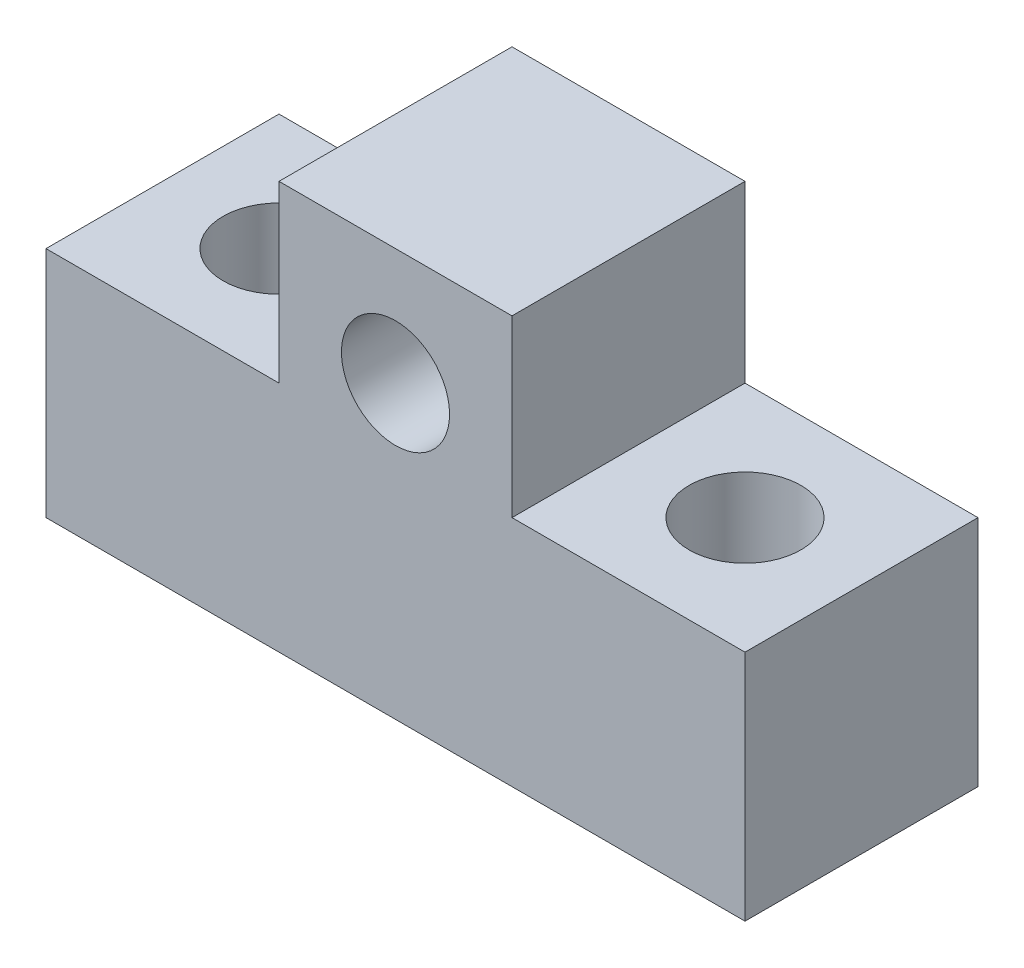
ISO-10303-21;
HEADER;
FILE_DESCRIPTION(('STEP AP214'),'2;1');
FILE_NAME('part.step','',(''),(''),'','','');
FILE_SCHEMA(('AUTOMOTIVE_DESIGN { 1 0 10303 214 1 1 1 1 }'));
ENDSEC;
DATA;
#1=APPLICATION_CONTEXT('core data for automotive mechanical design processes');
#2=APPLICATION_PROTOCOL_DEFINITION('international standard','automotive_design',2000,#1);
#3=PRODUCT_CONTEXT('',#1,'mechanical');
#4=PRODUCT('Part','Part','',(#3));
#5=PRODUCT_RELATED_PRODUCT_CATEGORY('part','',(#4));
#6=PRODUCT_DEFINITION_FORMATION('','',#4);
#7=PRODUCT_DEFINITION_CONTEXT('part definition',#1,'design');
#8=PRODUCT_DEFINITION('design','',#6,#7);
#9=PRODUCT_DEFINITION_SHAPE('','',#8);
#10=(LENGTH_UNIT() NAMED_UNIT(*) SI_UNIT(.MILLI.,.METRE.));
#11=(NAMED_UNIT(*) PLANE_ANGLE_UNIT() SI_UNIT($,.RADIAN.));
#12=(NAMED_UNIT(*) SI_UNIT($,.STERADIAN.) SOLID_ANGLE_UNIT());
#13=UNCERTAINTY_MEASURE_WITH_UNIT(LENGTH_MEASURE(1.E-05),#10,'distance_accuracy_value','');
#14=(GEOMETRIC_REPRESENTATION_CONTEXT(3) GLOBAL_UNCERTAINTY_ASSIGNED_CONTEXT((#13)) GLOBAL_UNIT_ASSIGNED_CONTEXT((#10,
#11,#12)) REPRESENTATION_CONTEXT('',''));
#15=CARTESIAN_POINT('',(0.,0.,0.));
#16=DIRECTION('',(0.,0.,1.));
#17=DIRECTION('',(1.,0.,0.));
#18=AXIS2_PLACEMENT_3D('',#15,#16,#17);
#19=CARTESIAN_POINT('',(-9.525,3.175,6.35));
#20=DIRECTION('',(0.,-1.,0.));
#21=DIRECTION('',(0.,0.,-1.));
#22=AXIS2_PLACEMENT_3D('',#19,#20,#21);
#23=PLANE('',#22);
#24=CARTESIAN_POINT('',(6.35,3.175,3.175));
#25=DIRECTION('',(0.,1.,0.));
#26=DIRECTION('',(0.,0.,1.));
#27=AXIS2_PLACEMENT_3D('',#24,#25,#26);
#28=CIRCLE('',#27,1.52399999999999);
#29=CARTESIAN_POINT('',(6.35,3.175,4.69899999999999));
#30=VERTEX_POINT('',#29);
#31=EDGE_CURVE('E177',#30,#30,#28,.T.);
#32=ORIENTED_EDGE('',*,*,#31,.F.);
#33=EDGE_LOOP('',(#32));
#34=FACE_BOUND('',#33,.T.);
#35=DIRECTION('',(0.,0.,-1.));
#36=VECTOR('',#35,1.);
#37=CARTESIAN_POINT('',(3.175,3.175,0.));
#38=LINE('',#37,#36);
#39=CARTESIAN_POINT('',(3.175,3.175,6.35));
#40=VERTEX_POINT('',#39);
#41=CARTESIAN_POINT('',(3.175,3.175,0.));
#42=VERTEX_POINT('',#41);
#43=EDGE_CURVE('E52',#40,#42,#38,.T.);
#44=ORIENTED_EDGE('',*,*,#43,.F.);
#45=DIRECTION('',(-1.,0.,0.));
#46=VECTOR('',#45,1.);
#47=CARTESIAN_POINT('',(-9.525,3.175,6.35));
#48=LINE('',#47,#46);
#49=CARTESIAN_POINT('',(9.525,3.175,6.35));
#50=VERTEX_POINT('',#49);
#51=EDGE_CURVE('E144',#50,#40,#48,.T.);
#52=ORIENTED_EDGE('',*,*,#51,.F.);
#53=DIRECTION('',(0.,0.,-1.));
#54=VECTOR('',#53,1.);
#55=CARTESIAN_POINT('',(9.525,3.175,6.35));
#56=LINE('',#55,#54);
#57=CARTESIAN_POINT('',(9.525,3.175,0.));
#58=VERTEX_POINT('',#57);
#59=EDGE_CURVE('E154',#50,#58,#56,.T.);
#60=ORIENTED_EDGE('',*,*,#59,.T.);
#61=DIRECTION('',(-1.,0.,0.));
#62=VECTOR('',#61,1.);
#63=CARTESIAN_POINT('',(-9.525,3.175,0.));
#64=LINE('',#63,#62);
#65=EDGE_CURVE('E139',#58,#42,#64,.T.);
#66=ORIENTED_EDGE('',*,*,#65,.T.);
#67=EDGE_LOOP('',(#44,#52,#60,#66));
#68=FACE_BOUND('',#67,.T.);
#69=ADVANCED_FACE('F37',(#34,#68),#23,.F.);
#70=CARTESIAN_POINT('',(-6.35,3.175,3.175));
#71=DIRECTION('',(0.,1.,0.));
#72=DIRECTION('',(0.,0.,1.));
#73=AXIS2_PLACEMENT_3D('',#70,#71,#72);
#74=CIRCLE('',#73,1.52399999999999);
#75=CARTESIAN_POINT('',(-6.35,3.175,4.69899999999999));
#76=VERTEX_POINT('',#75);
#77=EDGE_CURVE('E183',#76,#76,#74,.T.);
#78=ORIENTED_EDGE('',*,*,#77,.F.);
#79=EDGE_LOOP('',(#78));
#80=FACE_BOUND('',#79,.T.);
#81=DIRECTION('',(0.,0.,1.));
#82=VECTOR('',#81,1.);
#83=CARTESIAN_POINT('',(-3.175,3.175,0.));
#84=LINE('',#83,#82);
#85=CARTESIAN_POINT('',(-3.175,3.175,0.));
#86=VERTEX_POINT('',#85);
#87=CARTESIAN_POINT('',(-3.175,3.175,6.35));
#88=VERTEX_POINT('',#87);
#89=EDGE_CURVE('E60',#86,#88,#84,.T.);
#90=ORIENTED_EDGE('',*,*,#89,.F.);
#91=CARTESIAN_POINT('',(-9.525,3.175,0.));
#92=VERTEX_POINT('',#91);
#93=EDGE_CURVE('E150',#86,#92,#64,.T.);
#94=ORIENTED_EDGE('',*,*,#93,.T.);
#95=DIRECTION('',(0.,0.,-1.));
#96=VECTOR('',#95,1.);
#97=CARTESIAN_POINT('',(-9.525,3.175,6.35));
#98=LINE('',#97,#96);
#99=CARTESIAN_POINT('',(-9.525,3.175,6.35));
#100=VERTEX_POINT('',#99);
#101=EDGE_CURVE('E145',#100,#92,#98,.T.);
#102=ORIENTED_EDGE('',*,*,#101,.F.);
#103=EDGE_CURVE('E143',#88,#100,#48,.T.);
#104=ORIENTED_EDGE('',*,*,#103,.F.);
#105=EDGE_LOOP('',(#90,#94,#102,#104));
#106=FACE_BOUND('',#105,.T.);
#107=ADVANCED_FACE('F207',(#80,#106),#23,.F.);
#108=CARTESIAN_POINT('',(-9.525,3.175,6.35));
#109=DIRECTION('',(1.,0.,0.));
#110=DIRECTION('',(0.,0.,-1.));
#111=AXIS2_PLACEMENT_3D('',#108,#109,#110);
#112=PLANE('',#111);
#113=DIRECTION('',(0.,-1.,0.));
#114=VECTOR('',#113,1.);
#115=CARTESIAN_POINT('',(-9.525,3.175,0.));
#116=LINE('',#115,#114);
#117=CARTESIAN_POINT('',(-9.525,-3.175,0.));
#118=VERTEX_POINT('',#117);
#119=EDGE_CURVE('E126',#92,#118,#116,.T.);
#120=ORIENTED_EDGE('',*,*,#119,.T.);
#121=DIRECTION('',(0.,0.,-1.));
#122=VECTOR('',#121,1.);
#123=CARTESIAN_POINT('',(-9.525,-3.175,6.35));
#124=LINE('',#123,#122);
#125=CARTESIAN_POINT('',(-9.525,-3.175,6.35));
#126=VERTEX_POINT('',#125);
#127=EDGE_CURVE('E11',#126,#118,#124,.T.);
#128=ORIENTED_EDGE('',*,*,#127,.F.);
#129=DIRECTION('',(0.,-1.,0.));
#130=VECTOR('',#129,1.);
#131=CARTESIAN_POINT('',(-9.525,3.175,6.35));
#132=LINE('',#131,#130);
#133=EDGE_CURVE('E135',#100,#126,#132,.T.);
#134=ORIENTED_EDGE('',*,*,#133,.F.);
#135=ORIENTED_EDGE('',*,*,#101,.T.);
#136=EDGE_LOOP('',(#120,#128,#134,#135));
#137=FACE_BOUND('',#136,.T.);
#138=ADVANCED_FACE('F39',(#137),#112,.F.);
#139=CARTESIAN_POINT('',(-9.525,-3.175,6.35));
#140=DIRECTION('',(0.,1.,0.));
#141=DIRECTION('',(0.,0.,1.));
#142=AXIS2_PLACEMENT_3D('',#139,#140,#141);
#143=PLANE('',#142);
#144=CARTESIAN_POINT('',(-6.35,-3.175,3.175));
#145=DIRECTION('',(0.,1.,0.));
#146=DIRECTION('',(0.,0.,1.));
#147=AXIS2_PLACEMENT_3D('',#144,#145,#146);
#148=CIRCLE('',#147,1.524);
#149=CARTESIAN_POINT('',(-6.35,-3.175,4.699));
#150=VERTEX_POINT('',#149);
#151=EDGE_CURVE('E180',#150,#150,#148,.T.);
#152=ORIENTED_EDGE('',*,*,#151,.T.);
#153=EDGE_LOOP('',(#152));
#154=FACE_BOUND('',#153,.T.);
#155=CARTESIAN_POINT('',(6.35,-3.175,3.175));
#156=DIRECTION('',(0.,1.,0.));
#157=DIRECTION('',(0.,0.,1.));
#158=AXIS2_PLACEMENT_3D('',#155,#156,#157);
#159=CIRCLE('',#158,1.524);
#160=CARTESIAN_POINT('',(6.35,-3.175,4.699));
#161=VERTEX_POINT('',#160);
#162=EDGE_CURVE('E172',#161,#161,#159,.T.);
#163=ORIENTED_EDGE('',*,*,#162,.T.);
#164=EDGE_LOOP('',(#163));
#165=FACE_BOUND('',#164,.T.);
#166=DIRECTION('',(1.,0.,0.));
#167=VECTOR('',#166,1.);
#168=CARTESIAN_POINT('',(-9.525,-3.175,0.));
#169=LINE('',#168,#167);
#170=CARTESIAN_POINT('',(9.525,-3.175,0.));
#171=VERTEX_POINT('',#170);
#172=EDGE_CURVE('E129',#118,#171,#169,.T.);
#173=ORIENTED_EDGE('',*,*,#172,.T.);
#174=DIRECTION('',(0.,0.,-1.));
#175=VECTOR('',#174,1.);
#176=CARTESIAN_POINT('',(9.525,-3.175,6.35));
#177=LINE('',#176,#175);
#178=CARTESIAN_POINT('',(9.525,-3.175,6.35));
#179=VERTEX_POINT('',#178);
#180=EDGE_CURVE('E45',#179,#171,#177,.T.);
#181=ORIENTED_EDGE('',*,*,#180,.F.);
#182=DIRECTION('',(1.,0.,0.));
#183=VECTOR('',#182,1.);
#184=CARTESIAN_POINT('',(-9.525,-3.175,6.35));
#185=LINE('',#184,#183);
#186=EDGE_CURVE('E138',#126,#179,#185,.T.);
#187=ORIENTED_EDGE('',*,*,#186,.F.);
#188=ORIENTED_EDGE('',*,*,#127,.T.);
#189=EDGE_LOOP('',(#173,#181,#187,#188));
#190=FACE_BOUND('',#189,.T.);
#191=ADVANCED_FACE('F203',(#154,#165,#190),#143,.F.);
#192=CARTESIAN_POINT('',(9.525,3.175,6.35));
#193=DIRECTION('',(-1.,0.,0.));
#194=DIRECTION('',(0.,0.,1.));
#195=AXIS2_PLACEMENT_3D('',#192,#193,#194);
#196=PLANE('',#195);
#197=DIRECTION('',(0.,1.,0.));
#198=VECTOR('',#197,1.);
#199=CARTESIAN_POINT('',(9.525,3.175,0.));
#200=LINE('',#199,#198);
#201=EDGE_CURVE('E148',#171,#58,#200,.T.);
#202=ORIENTED_EDGE('',*,*,#201,.T.);
#203=ORIENTED_EDGE('',*,*,#59,.F.);
#204=DIRECTION('',(0.,1.,0.));
#205=VECTOR('',#204,1.);
#206=CARTESIAN_POINT('',(9.525,3.175,6.35));
#207=LINE('',#206,#205);
#208=EDGE_CURVE('E141',#179,#50,#207,.T.);
#209=ORIENTED_EDGE('',*,*,#208,.F.);
#210=ORIENTED_EDGE('',*,*,#180,.T.);
#211=EDGE_LOOP('',(#202,#203,#209,#210));
#212=FACE_BOUND('',#211,.T.);
#213=ADVANCED_FACE('F161',(#212),#196,.F.);
#214=CARTESIAN_POINT('',(0.,0.,6.35));
#215=DIRECTION('',(0.,0.,1.));
#216=DIRECTION('',(1.,0.,0.));
#217=AXIS2_PLACEMENT_3D('',#214,#215,#216);
#218=PLANE('',#217);
#219=CARTESIAN_POINT('',(0.,4.7625,6.35));
#220=DIRECTION('',(0.,0.,1.));
#221=DIRECTION('',(1.,0.,0.));
#222=AXIS2_PLACEMENT_3D('',#219,#220,#221);
#223=CIRCLE('',#222,1.47319999999999);
#224=CARTESIAN_POINT('',(1.47319999999999,4.7625,6.35));
#225=VERTEX_POINT('',#224);
#226=EDGE_CURVE('E189',#225,#225,#223,.T.);
#227=ORIENTED_EDGE('',*,*,#226,.F.);
#228=EDGE_LOOP('',(#227));
#229=FACE_BOUND('',#228,.T.);
#230=ORIENTED_EDGE('',*,*,#133,.T.);
#231=ORIENTED_EDGE('',*,*,#186,.T.);
#232=ORIENTED_EDGE('',*,*,#208,.T.);
#233=ORIENTED_EDGE('',*,*,#51,.T.);
#234=DIRECTION('',(0.,-1.,0.));
#235=VECTOR('',#234,1.);
#236=CARTESIAN_POINT('',(3.175,7.9375,6.35));
#237=LINE('',#236,#235);
#238=CARTESIAN_POINT('',(3.175,7.9375,6.35));
#239=VERTEX_POINT('',#238);
#240=EDGE_CURVE('E166',#239,#40,#237,.T.);
#241=ORIENTED_EDGE('',*,*,#240,.F.);
#242=DIRECTION('',(1.,0.,0.));
#243=VECTOR('',#242,1.);
#244=CARTESIAN_POINT('',(3.175,7.9375,6.35));
#245=LINE('',#244,#243);
#246=CARTESIAN_POINT('',(-3.175,7.9375,6.35));
#247=VERTEX_POINT('',#246);
#248=EDGE_CURVE('E120',#247,#239,#245,.T.);
#249=ORIENTED_EDGE('',*,*,#248,.F.);
#250=DIRECTION('',(0.,-1.,0.));
#251=VECTOR('',#250,1.);
#252=CARTESIAN_POINT('',(-3.175,7.9375,6.35));
#253=LINE('',#252,#251);
#254=EDGE_CURVE('E131',#247,#88,#253,.T.);
#255=ORIENTED_EDGE('',*,*,#254,.T.);
#256=ORIENTED_EDGE('',*,*,#103,.T.);
#257=EDGE_LOOP('',(#230,#231,#232,#233,#241,#249,#255,#256));
#258=FACE_BOUND('',#257,.T.);
#259=ADVANCED_FACE('F165',(#229,#258),#218,.T.);
#260=CARTESIAN_POINT('',(0.,0.,0.));
#261=DIRECTION('',(0.,0.,1.));
#262=DIRECTION('',(1.,0.,0.));
#263=AXIS2_PLACEMENT_3D('',#260,#261,#262);
#264=PLANE('',#263);
#265=CARTESIAN_POINT('',(0.,4.7625,0.));
#266=DIRECTION('',(0.,0.,1.));
#267=DIRECTION('',(1.,0.,0.));
#268=AXIS2_PLACEMENT_3D('',#265,#266,#267);
#269=CIRCLE('',#268,1.4732);
#270=CARTESIAN_POINT('',(1.4732,4.7625,0.));
#271=VERTEX_POINT('',#270);
#272=EDGE_CURVE('E186',#271,#271,#269,.T.);
#273=ORIENTED_EDGE('',*,*,#272,.T.);
#274=EDGE_LOOP('',(#273));
#275=FACE_BOUND('',#274,.T.);
#276=ORIENTED_EDGE('',*,*,#119,.F.);
#277=ORIENTED_EDGE('',*,*,#93,.F.);
#278=DIRECTION('',(0.,-1.,0.));
#279=VECTOR('',#278,1.);
#280=CARTESIAN_POINT('',(-3.175,7.9375,0.));
#281=LINE('',#280,#279);
#282=CARTESIAN_POINT('',(-3.175,7.9375,0.));
#283=VERTEX_POINT('',#282);
#284=EDGE_CURVE('E111',#283,#86,#281,.T.);
#285=ORIENTED_EDGE('',*,*,#284,.F.);
#286=DIRECTION('',(-1.,0.,0.));
#287=VECTOR('',#286,1.);
#288=CARTESIAN_POINT('',(3.175,7.9375,0.));
#289=LINE('',#288,#287);
#290=CARTESIAN_POINT('',(3.175,7.9375,0.));
#291=VERTEX_POINT('',#290);
#292=EDGE_CURVE('E103',#291,#283,#289,.T.);
#293=ORIENTED_EDGE('',*,*,#292,.F.);
#294=DIRECTION('',(0.,-1.,0.));
#295=VECTOR('',#294,1.);
#296=CARTESIAN_POINT('',(3.175,7.9375,0.));
#297=LINE('',#296,#295);
#298=EDGE_CURVE('E109',#291,#42,#297,.T.);
#299=ORIENTED_EDGE('',*,*,#298,.T.);
#300=ORIENTED_EDGE('',*,*,#65,.F.);
#301=ORIENTED_EDGE('',*,*,#201,.F.);
#302=ORIENTED_EDGE('',*,*,#172,.F.);
#303=EDGE_LOOP('',(#276,#277,#285,#293,#299,#300,#301,#302));
#304=FACE_BOUND('',#303,.T.);
#305=ADVANCED_FACE('F106',(#275,#304),#264,.F.);
#306=CARTESIAN_POINT('',(3.175,7.9375,0.));
#307=DIRECTION('',(-1.,0.,0.));
#308=DIRECTION('',(0.,0.,1.));
#309=AXIS2_PLACEMENT_3D('',#306,#307,#308);
#310=PLANE('',#309);
#311=ORIENTED_EDGE('',*,*,#43,.T.);
#312=ORIENTED_EDGE('',*,*,#298,.F.);
#313=DIRECTION('',(0.,0.,-1.));
#314=VECTOR('',#313,1.);
#315=CARTESIAN_POINT('',(3.175,7.9375,0.));
#316=LINE('',#315,#314);
#317=EDGE_CURVE('E115',#239,#291,#316,.T.);
#318=ORIENTED_EDGE('',*,*,#317,.F.);
#319=ORIENTED_EDGE('',*,*,#240,.T.);
#320=EDGE_LOOP('',(#311,#312,#318,#319));
#321=FACE_BOUND('',#320,.T.);
#322=ADVANCED_FACE('F125',(#321),#310,.F.);
#323=CARTESIAN_POINT('',(-3.175,7.9375,0.));
#324=DIRECTION('',(1.,0.,0.));
#325=DIRECTION('',(0.,0.,-1.));
#326=AXIS2_PLACEMENT_3D('',#323,#324,#325);
#327=PLANE('',#326);
#328=ORIENTED_EDGE('',*,*,#89,.T.);
#329=ORIENTED_EDGE('',*,*,#254,.F.);
#330=DIRECTION('',(0.,0.,1.));
#331=VECTOR('',#330,1.);
#332=CARTESIAN_POINT('',(-3.175,7.9375,0.));
#333=LINE('',#332,#331);
#334=EDGE_CURVE('E114',#283,#247,#333,.T.);
#335=ORIENTED_EDGE('',*,*,#334,.F.);
#336=ORIENTED_EDGE('',*,*,#284,.T.);
#337=EDGE_LOOP('',(#328,#329,#335,#336));
#338=FACE_BOUND('',#337,.T.);
#339=ADVANCED_FACE('F228',(#338),#327,.F.);
#340=CARTESIAN_POINT('',(0.,7.9375,0.));
#341=DIRECTION('',(0.,-1.,0.));
#342=DIRECTION('',(0.,0.,-1.));
#343=AXIS2_PLACEMENT_3D('',#340,#341,#342);
#344=PLANE('',#343);
#345=ORIENTED_EDGE('',*,*,#317,.T.);
#346=ORIENTED_EDGE('',*,*,#292,.T.);
#347=ORIENTED_EDGE('',*,*,#334,.T.);
#348=ORIENTED_EDGE('',*,*,#248,.T.);
#349=EDGE_LOOP('',(#345,#346,#347,#348));
#350=FACE_BOUND('',#349,.T.);
#351=ADVANCED_FACE('F118',(#350),#344,.F.);
#352=CARTESIAN_POINT('',(6.35,3.175,3.175));
#353=DIRECTION('',(0.,1.,0.));
#354=DIRECTION('',(0.,0.,1.));
#355=AXIS2_PLACEMENT_3D('',#352,#353,#354);
#356=CYLINDRICAL_SURFACE('',#355,1.52399999999999);
#357=ORIENTED_EDGE('',*,*,#162,.F.);
#358=EDGE_LOOP('',(#357));
#359=FACE_BOUND('',#358,.T.);
#360=ORIENTED_EDGE('',*,*,#31,.T.);
#361=EDGE_LOOP('',(#360));
#362=FACE_BOUND('',#361,.T.);
#363=ADVANCED_FACE('F236',(#359,#362),#356,.F.);
#364=CARTESIAN_POINT('',(-6.35,3.175,3.175));
#365=DIRECTION('',(0.,1.,0.));
#366=DIRECTION('',(0.,0.,1.));
#367=AXIS2_PLACEMENT_3D('',#364,#365,#366);
#368=CYLINDRICAL_SURFACE('',#367,1.52399999999999);
#369=ORIENTED_EDGE('',*,*,#151,.F.);
#370=EDGE_LOOP('',(#369));
#371=FACE_BOUND('',#370,.T.);
#372=ORIENTED_EDGE('',*,*,#77,.T.);
#373=EDGE_LOOP('',(#372));
#374=FACE_BOUND('',#373,.T.);
#375=ADVANCED_FACE('F241',(#371,#374),#368,.F.);
#376=CARTESIAN_POINT('',(0.,4.7625,6.35));
#377=DIRECTION('',(0.,0.,1.));
#378=DIRECTION('',(1.,0.,0.));
#379=AXIS2_PLACEMENT_3D('',#376,#377,#378);
#380=CYLINDRICAL_SURFACE('',#379,1.47319999999999);
#381=ORIENTED_EDGE('',*,*,#272,.F.);
#382=EDGE_LOOP('',(#381));
#383=FACE_BOUND('',#382,.T.);
#384=ORIENTED_EDGE('',*,*,#226,.T.);
#385=EDGE_LOOP('',(#384));
#386=FACE_BOUND('',#385,.T.);
#387=ADVANCED_FACE('F193',(#383,#386),#380,.F.);
#388=CLOSED_SHELL('',(#69,#107,#138,#191,#213,#259,#305,#322,#339,#351,#363,#375,#387));
#389=MANIFOLD_SOLID_BREP('B2',#388);
#390=ADVANCED_BREP_SHAPE_REPRESENTATION('',(#18,#389),#14);
#391=SHAPE_DEFINITION_REPRESENTATION(#9,#390);
ENDSEC;
END-ISO-10303-21;
